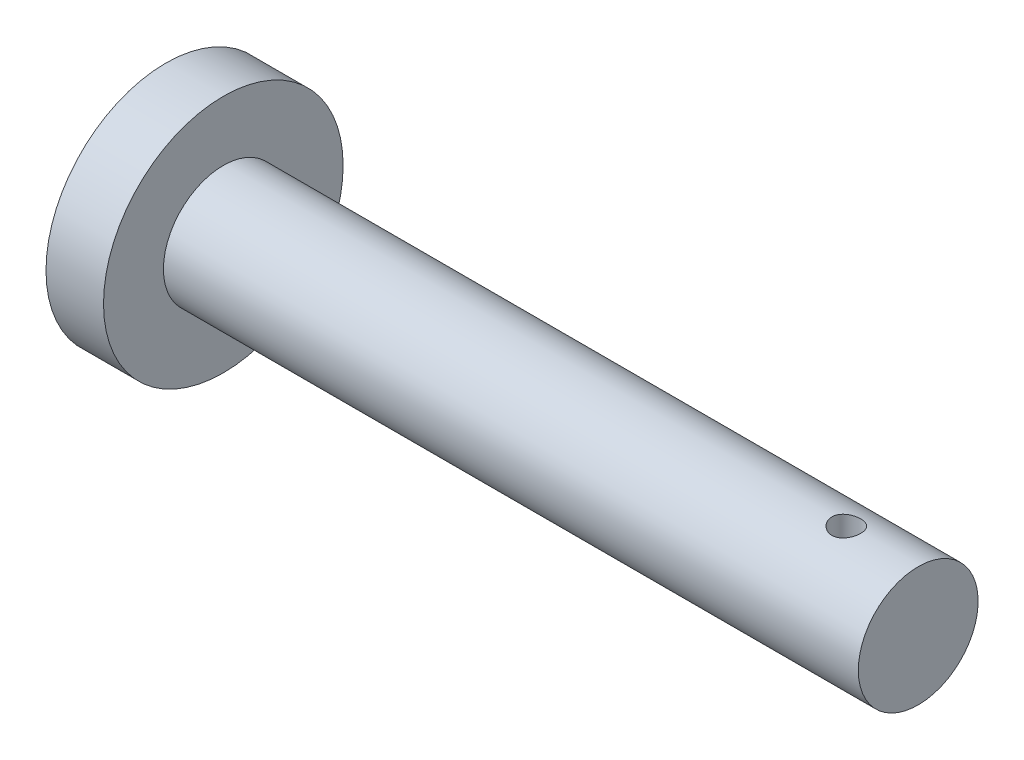
ISO-10303-21;
HEADER;
FILE_DESCRIPTION(('STEP AP214'),'2;1');
FILE_NAME('part.step','',(''),(''),'','','');
FILE_SCHEMA(('AUTOMOTIVE_DESIGN { 1 0 10303 214 1 1 1 1 }'));
ENDSEC;
DATA;
#1=APPLICATION_CONTEXT('core data for automotive mechanical design processes');
#2=APPLICATION_PROTOCOL_DEFINITION('international standard','automotive_design',2000,#1);
#3=PRODUCT_CONTEXT('',#1,'mechanical');
#4=PRODUCT('Part','Part','',(#3));
#5=PRODUCT_RELATED_PRODUCT_CATEGORY('part','',(#4));
#6=PRODUCT_DEFINITION_FORMATION('','',#4);
#7=PRODUCT_DEFINITION_CONTEXT('part definition',#1,'design');
#8=PRODUCT_DEFINITION('design','',#6,#7);
#9=PRODUCT_DEFINITION_SHAPE('','',#8);
#10=(LENGTH_UNIT() NAMED_UNIT(*) SI_UNIT(.MILLI.,.METRE.));
#11=(NAMED_UNIT(*) PLANE_ANGLE_UNIT() SI_UNIT($,.RADIAN.));
#12=(NAMED_UNIT(*) SI_UNIT($,.STERADIAN.) SOLID_ANGLE_UNIT());
#13=UNCERTAINTY_MEASURE_WITH_UNIT(LENGTH_MEASURE(1.E-05),#10,'distance_accuracy_value','');
#14=(GEOMETRIC_REPRESENTATION_CONTEXT(3) GLOBAL_UNCERTAINTY_ASSIGNED_CONTEXT((#13)) GLOBAL_UNIT_ASSIGNED_CONTEXT((#10,
#11,#12)) REPRESENTATION_CONTEXT('',''));
#15=CARTESIAN_POINT('',(0.,0.,0.));
#16=DIRECTION('',(0.,0.,1.));
#17=DIRECTION('',(1.,0.,0.));
#18=AXIS2_PLACEMENT_3D('',#15,#16,#17);
#19=CARTESIAN_POINT('',(0.,0.,0.));
#20=DIRECTION('',(-1.,0.,0.));
#21=DIRECTION('',(0.,0.,1.));
#22=AXIS2_PLACEMENT_3D('',#19,#20,#21);
#23=PLANE('',#22);
#24=CARTESIAN_POINT('',(0.,0.,0.));
#25=DIRECTION('',(-1.,0.,0.));
#26=DIRECTION('',(0.,0.,1.));
#27=AXIS2_PLACEMENT_3D('',#24,#25,#26);
#28=CIRCLE('',#27,12.5);
#29=CARTESIAN_POINT('',(0.,0.,12.5));
#30=VERTEX_POINT('',#29);
#31=EDGE_CURVE('E10',#30,#30,#28,.T.);
#32=ORIENTED_EDGE('',*,*,#31,.F.);
#33=EDGE_LOOP('',(#32));
#34=FACE_BOUND('',#33,.T.);
#35=ADVANCED_FACE('F30',(#34),#23,.F.);
#36=CARTESIAN_POINT('',(-157.,0.,0.));
#37=DIRECTION('',(-1.,0.,0.));
#38=DIRECTION('',(0.,0.,1.));
#39=AXIS2_PLACEMENT_3D('',#36,#37,#38);
#40=CYLINDRICAL_SURFACE('',#39,12.5);
#41=CARTESIAN_POINT('',(-15.,-12.1346610995116,3.));
#42=CARTESIAN_POINT('',(-14.8341136860563,-12.1346643709057,2.999994926396));
#43=CARTESIAN_POINT('',(-14.6681696981775,-12.1380998279897,2.9861940157555));
#44=CARTESIAN_POINT('',(-14.3410316472803,-12.1514386999622,2.93143372377318));
#45=CARTESIAN_POINT('',(-14.179840636512,-12.1613461803941,2.89045727127241));
#46=CARTESIAN_POINT('',(-13.866987704597,-12.1864438536979,2.78273587845348));
#47=CARTESIAN_POINT('',(-13.7153143658059,-12.2016275682829,2.71602252749926));
#48=CARTESIAN_POINT('',(-13.4253004563428,-12.2355589227548,2.55881551789466));
#49=CARTESIAN_POINT('',(-13.2869601763304,-12.2543066403104,2.46832134098417));
#50=CARTESIAN_POINT('',(-13.0247311850598,-12.2936793084446,2.26416092165145));
#51=CARTESIAN_POINT('',(-12.9011528440104,-12.3143323081787,2.15010136587796));
#52=CARTESIAN_POINT('',(-12.6746846055658,-12.3549444196641,1.90289576315871));
#53=CARTESIAN_POINT('',(-12.5717965288073,-12.3749034702238,1.76974803831651));
#54=CARTESIAN_POINT('',(-12.3883735672939,-12.4121875957975,1.48603435008245));
#55=CARTESIAN_POINT('',(-12.3081414764507,-12.429475709008,1.33526735140698));
#56=CARTESIAN_POINT('',(-12.1742734626821,-12.4591511096291,1.0219036434405));
#57=CARTESIAN_POINT('',(-12.1206339318546,-12.471539061815,0.859308542342426));
#58=CARTESIAN_POINT('',(-12.0424618456135,-12.4898200905274,0.530137152798911));
#59=CARTESIAN_POINT('',(-12.0174027857917,-12.4958305032045,0.363692527541));
#60=CARTESIAN_POINT('',(-11.9954524803083,-12.5010873481438,0.0288605739758598));
#61=CARTESIAN_POINT('',(-11.9985573840758,-12.5003347050497,-0.139526485618308));
#62=CARTESIAN_POINT('',(-12.0324637007849,-12.49223836428,-0.469819197188795));
#63=CARTESIAN_POINT('',(-12.0626970841685,-12.4850298487431,-0.631786969117104));
#64=CARTESIAN_POINT('',(-12.1490917379628,-12.4649879597451,-0.948279915829271));
#65=CARTESIAN_POINT('',(-12.2052543251028,-12.4521543006312,-1.10280471220598));
#66=CARTESIAN_POINT('',(-12.3423868327477,-12.4220937673228,-1.40154850796015));
#67=CARTESIAN_POINT('',(-12.4235632557684,-12.4048305309055,-1.54566890739797));
#68=CARTESIAN_POINT('',(-12.6082634336662,-12.3677903650575,-1.81844374815069));
#69=CARTESIAN_POINT('',(-12.7117908007732,-12.3480130295253,-1.94709568430373));
#70=CARTESIAN_POINT('',(-12.9413154010846,-12.307523454591,-2.18866676072893));
#71=CARTESIAN_POINT('',(-13.0678093661689,-12.2868002024655,-2.30111257110785));
#72=CARTESIAN_POINT('',(-13.3380756361584,-12.247210122564,-2.50329554889259));
#73=CARTESIAN_POINT('',(-13.4818486239031,-12.2283433682075,-2.59303181841776));
#74=CARTESIAN_POINT('',(-13.7834652562631,-12.1945661246798,-2.74751986313759));
#75=CARTESIAN_POINT('',(-13.9413650510763,-12.1796724534131,-2.81216594132899));
#76=CARTESIAN_POINT('',(-14.2662331234768,-12.155748323081,-2.91385324316721));
#77=CARTESIAN_POINT('',(-14.4331996246833,-12.1467167199581,-2.95089985341171));
#78=CARTESIAN_POINT('',(-14.7670933800678,-12.1357772660229,-2.99556850234642));
#79=CARTESIAN_POINT('',(-14.9339220725108,-12.1337008786288,-3.00388683328911));
#80=CARTESIAN_POINT('',(-15.2665831940748,-12.1364495609797,-2.99276203410493));
#81=CARTESIAN_POINT('',(-15.4324157058037,-12.1412740503119,-2.97332123871795));
#82=CARTESIAN_POINT('',(-15.7558459172609,-12.1571201522343,-2.90783852027801));
#83=CARTESIAN_POINT('',(-15.9135291759169,-12.1680489760353,-2.86219461484814));
#84=CARTESIAN_POINT('',(-16.219007820667,-12.1947857126681,-2.74603914988784));
#85=CARTESIAN_POINT('',(-16.3668021054363,-12.2105941678427,-2.67552482603031));
#86=CARTESIAN_POINT('',(-16.6512787522039,-12.2456689266468,-2.51014743676235));
#87=CARTESIAN_POINT('',(-16.787709374006,-12.2649930224287,-2.41486385815303));
#88=CARTESIAN_POINT('',(-17.0429007338939,-12.3047764880024,-2.20319051610381));
#89=CARTESIAN_POINT('',(-17.1616588009854,-12.3252360287629,-2.08679756812263));
#90=CARTESIAN_POINT('',(-17.3809150096092,-12.3655511140332,-1.83302860512641));
#91=CARTESIAN_POINT('',(-17.4809337559896,-12.3853821651221,-1.69523379949056));
#92=CARTESIAN_POINT('',(-17.656408463085,-12.4217193399951,-1.40439761806721));
#93=CARTESIAN_POINT('',(-17.7318656724446,-12.438225632785,-1.25135701785303));
#94=CARTESIAN_POINT('',(-17.855447477275,-12.4659520953338,-0.935406182533396));
#95=CARTESIAN_POINT('',(-17.9037623205216,-12.4772089625634,-0.772573732033524));
#96=CARTESIAN_POINT('',(-17.9722678203968,-12.4933282808784,-0.44079751662121));
#97=CARTESIAN_POINT('',(-17.9924634527554,-12.4981918632553,-0.271854838350957));
#98=CARTESIAN_POINT('',(-18.003895867787,-12.5009346170348,0.0628273325379078));
#99=CARTESIAN_POINT('',(-17.9958427559416,-12.4989850590467,0.22854154859205));
#100=CARTESIAN_POINT('',(-17.9526200369824,-12.4886960978661,0.556181588106272));
#101=CARTESIAN_POINT('',(-17.9174511235912,-12.4803568581455,0.718107508375785));
#102=CARTESIAN_POINT('',(-17.8213631748843,-12.4582475403262,1.03289533638029));
#103=CARTESIAN_POINT('',(-17.7605634305591,-12.4445026408745,1.18579554017999));
#104=CARTESIAN_POINT('',(-17.6150497558514,-12.4130357959962,1.47930912419136));
#105=CARTESIAN_POINT('',(-17.5303330262537,-12.3953133850962,1.61992106367531));
#106=CARTESIAN_POINT('',(-17.337174525723,-12.3573152907204,1.88826701153781));
#107=CARTESIAN_POINT('',(-17.2282449292564,-12.3369914041701,2.01564306622629));
#108=CARTESIAN_POINT('',(-16.9907123894102,-12.296311274744,2.25054951565269));
#109=CARTESIAN_POINT('',(-16.8621045592637,-12.2759550250775,2.35807496614236));
#110=CARTESIAN_POINT('',(-16.5862606058398,-12.2371275634283,2.5519948518568));
#111=CARTESIAN_POINT('',(-16.438747379493,-12.2186938455572,2.63800316633774));
#112=CARTESIAN_POINT('',(-16.1309381534944,-12.1862909651906,2.78387070894251));
#113=CARTESIAN_POINT('',(-15.9706520843289,-12.1723183758181,2.84375002144869));
#114=CARTESIAN_POINT('',(-15.6754071464859,-12.1527391085338,2.92614436386637));
#115=CARTESIAN_POINT('',(-15.5419291717888,-12.1460087939348,2.95378236710749));
#116=CARTESIAN_POINT('',(-15.2723136259292,-12.1369686046644,2.99071161192546));
#117=CARTESIAN_POINT('',(-15.1361762455769,-12.1346584140208,3.00000416492674));
#118=CARTESIAN_POINT('',(-15.,-12.1346610995116,3.));
#119=B_SPLINE_CURVE_WITH_KNOTS('',3,(#41,#42,#43,#44,#45,#46,#47,#48,#49,#50,#51,#52,#53,#54,
#55,#56,#57,#58,#59,#60,#61,#62,#63,#64,#65,#66,#67,#68,#69,#70,#71,#72,#73,#74,#75,#76,#77,#78,
#79,#80,#81,#82,#83,#84,#85,#86,#87,#88,#89,#90,#91,#92,#93,#94,#95,#96,#97,#98,#99,#100,#101,
#102,#103,#104,#105,#106,#107,#108,#109,#110,#111,#112,#113,#114,#115,#116,#117,#118),
.UNSPECIFIED.,.T.,.F.,(4,2,2,2,2,2,2,2,2,2,2,2,2,2,2,2,2,2,2,2,2,2,2,2,2,2,2,2,2,2,2,2,2,2,2,2,
2,2,4),(0.,0.497159212189435,0.9946310265389,1.49149417875254,1.98836816009861,2.49432418194045,
3.00032470584734,3.51279830766303,4.02520236141813,4.52800628486068,5.03074146609936,
5.52318961529222,6.01566277459448,6.51231571921414,7.00904899016388,7.51819168467208,
8.02735450631452,8.53863957226521,9.04982482437228,9.54852995993759,10.047193153326,
10.5384749824062,11.0298114342859,11.5301065260645,12.0304771548043,12.5422844123508,
13.0540656468818,13.5622134292334,14.0702712827588,14.5656502933719,15.0610166307768,
15.5541024543049,16.047246011943,16.5514085771014,17.0556965465884,17.56847227941,
18.0808531634825,18.4890008491296,18.8971193572843),.UNSPECIFIED.);
#120=CARTESIAN_POINT('',(-15.,-12.1346610995116,3.));
#121=VERTEX_POINT('',#120);
#122=EDGE_CURVE('E33',#121,#121,#119,.T.);
#123=ORIENTED_EDGE('',*,*,#122,.T.);
#124=EDGE_LOOP('',(#123));
#125=FACE_BOUND('',#124,.T.);
#126=CARTESIAN_POINT('',(-15.,12.1346610995116,3.));
#127=CARTESIAN_POINT('',(-15.1658863139436,12.1346643709057,2.999994926396));
#128=CARTESIAN_POINT('',(-15.3318303018224,12.1380998279897,2.9861940157555));
#129=CARTESIAN_POINT('',(-15.6589683527196,12.1514386999622,2.93143372377318));
#130=CARTESIAN_POINT('',(-15.8201593634879,12.1613461803941,2.89045727127241));
#131=CARTESIAN_POINT('',(-16.1330122954029,12.1864438536979,2.78273587845348));
#132=CARTESIAN_POINT('',(-16.284685634194,12.2016275682829,2.71602252749926));
#133=CARTESIAN_POINT('',(-16.5746995436572,12.2355589227548,2.55881551789466));
#134=CARTESIAN_POINT('',(-16.7130398236695,12.2543066403104,2.46832134098417));
#135=CARTESIAN_POINT('',(-16.9752688149401,12.2936793084446,2.26416092165145));
#136=CARTESIAN_POINT('',(-17.0988471559895,12.3143323081787,2.15010136587795));
#137=CARTESIAN_POINT('',(-17.3253153944341,12.3549444196641,1.90289576315871));
#138=CARTESIAN_POINT('',(-17.4282034711926,12.3749034702238,1.7697480383165));
#139=CARTESIAN_POINT('',(-17.611626432706,12.4121875957975,1.48603435008244));
#140=CARTESIAN_POINT('',(-17.6918585235492,12.429475709008,1.33526735140698));
#141=CARTESIAN_POINT('',(-17.8257265373178,12.4591511096291,1.0219036434405));
#142=CARTESIAN_POINT('',(-17.8793660681453,12.471539061815,0.859308542342424));
#143=CARTESIAN_POINT('',(-17.9575381543864,12.4898200905274,0.530137152798909));
#144=CARTESIAN_POINT('',(-17.9825972142082,12.4958305032045,0.363692527540998));
#145=CARTESIAN_POINT('',(-18.0045475196916,12.5010873481438,0.0288605739758569));
#146=CARTESIAN_POINT('',(-18.0014426159241,12.5003347050497,-0.139526485618311));
#147=CARTESIAN_POINT('',(-17.967536299215,12.49223836428,-0.469819197188798));
#148=CARTESIAN_POINT('',(-17.9373029158314,12.4850298487431,-0.631786969117107));
#149=CARTESIAN_POINT('',(-17.8509082620371,12.4649879597451,-0.948279915829274));
#150=CARTESIAN_POINT('',(-17.7947456748971,12.4521543006312,-1.10280471220598));
#151=CARTESIAN_POINT('',(-17.6576131672522,12.4220937673228,-1.40154850796015));
#152=CARTESIAN_POINT('',(-17.5764367442315,12.4048305309055,-1.54566890739798));
#153=CARTESIAN_POINT('',(-17.3917365663337,12.3677903650575,-1.8184437481507));
#154=CARTESIAN_POINT('',(-17.2882091992267,12.3480130295253,-1.94709568430374));
#155=CARTESIAN_POINT('',(-17.0586845989154,12.307523454591,-2.18866676072893));
#156=CARTESIAN_POINT('',(-16.932190633831,12.2868002024655,-2.30111257110785));
#157=CARTESIAN_POINT('',(-16.6619243638415,12.247210122564,-2.50329554889259));
#158=CARTESIAN_POINT('',(-16.5181513760968,12.2283433682075,-2.59303181841777));
#159=CARTESIAN_POINT('',(-16.2165347437368,12.1945661246798,-2.74751986313759));
#160=CARTESIAN_POINT('',(-16.0586349489236,12.1796724534131,-2.81216594132899));
#161=CARTESIAN_POINT('',(-15.7337668765231,12.155748323081,-2.91385324316721));
#162=CARTESIAN_POINT('',(-15.5668003753166,12.1467167199581,-2.95089985341171));
#163=CARTESIAN_POINT('',(-15.2329066199321,12.1357772660229,-2.99556850234642));
#164=CARTESIAN_POINT('',(-15.0660779274891,12.1337008786288,-3.00388683328911));
#165=CARTESIAN_POINT('',(-14.7334168059252,12.1364495609797,-2.99276203410493));
#166=CARTESIAN_POINT('',(-14.5675842941962,12.1412740503119,-2.97332123871795));
#167=CARTESIAN_POINT('',(-14.244154082739,12.1571201522343,-2.90783852027801));
#168=CARTESIAN_POINT('',(-14.086470824083,12.1680489760353,-2.86219461484814));
#169=CARTESIAN_POINT('',(-13.7809921793329,12.1947857126681,-2.74603914988784));
#170=CARTESIAN_POINT('',(-13.6331978945637,12.2105941678427,-2.6755248260303));
#171=CARTESIAN_POINT('',(-13.348721247796,12.2456689266468,-2.51014743676235));
#172=CARTESIAN_POINT('',(-13.2122906259939,12.2649930224287,-2.41486385815303));
#173=CARTESIAN_POINT('',(-12.957099266106,12.3047764880024,-2.2031905161038));
#174=CARTESIAN_POINT('',(-12.8383411990145,12.3252360287629,-2.08679756812263));
#175=CARTESIAN_POINT('',(-12.6190849903907,12.3655511140332,-1.8330286051264));
#176=CARTESIAN_POINT('',(-12.5190662440103,12.3853821651221,-1.69523379949055));
#177=CARTESIAN_POINT('',(-12.3435915369149,12.4217193399951,-1.4043976180672));
#178=CARTESIAN_POINT('',(-12.2681343275553,12.438225632785,-1.25135701785302));
#179=CARTESIAN_POINT('',(-12.1445525227249,12.4659520953338,-0.935406182533391));
#180=CARTESIAN_POINT('',(-12.0962376794783,12.4772089625634,-0.772573732033519));
#181=CARTESIAN_POINT('',(-12.0277321796031,12.4933282808784,-0.440797516621206));
#182=CARTESIAN_POINT('',(-12.0075365472445,12.4981918632553,-0.271854838350953));
#183=CARTESIAN_POINT('',(-11.9961041322129,12.5009346170348,0.0628273325379106));
#184=CARTESIAN_POINT('',(-12.0041572440584,12.4989850590467,0.228541548592053));
#185=CARTESIAN_POINT('',(-12.0473799630175,12.4886960978661,0.556181588106275));
#186=CARTESIAN_POINT('',(-12.0825488764087,12.4803568581455,0.718107508375788));
#187=CARTESIAN_POINT('',(-12.1786368251157,12.4582475403261,1.03289533638029));
#188=CARTESIAN_POINT('',(-12.2394365694408,12.4445026408745,1.18579554017999));
#189=CARTESIAN_POINT('',(-12.3849502441486,12.4130357959962,1.47930912419136));
#190=CARTESIAN_POINT('',(-12.4696669737462,12.3953133850962,1.61992106367531));
#191=CARTESIAN_POINT('',(-12.6628254742769,12.3573152907204,1.88826701153781));
#192=CARTESIAN_POINT('',(-12.7717550707435,12.3369914041701,2.01564306622629));
#193=CARTESIAN_POINT('',(-13.0092876105897,12.296311274744,2.25054951565269));
#194=CARTESIAN_POINT('',(-13.1378954407363,12.2759550250775,2.35807496614237));
#195=CARTESIAN_POINT('',(-13.4137393941601,12.2371275634283,2.5519948518568));
#196=CARTESIAN_POINT('',(-13.561252620507,12.2186938455572,2.63800316633774));
#197=CARTESIAN_POINT('',(-13.8690618465055,12.1862909651906,2.78387070894252));
#198=CARTESIAN_POINT('',(-14.029347915671,12.1723183758181,2.84375002144869));
#199=CARTESIAN_POINT('',(-14.324592853514,12.1527391085338,2.92614436386637));
#200=CARTESIAN_POINT('',(-14.4580708282112,12.1460087939348,2.95378236710749));
#201=CARTESIAN_POINT('',(-14.7276863740708,12.1369686046644,2.99071161192546));
#202=CARTESIAN_POINT('',(-14.863823754423,12.1346584140208,3.00000416492674));
#203=CARTESIAN_POINT('',(-15.,12.1346610995116,3.));
#204=B_SPLINE_CURVE_WITH_KNOTS('',3,(#126,#127,#128,#129,#130,#131,#132,#133,#134,#135,#136,
#137,#138,#139,#140,#141,#142,#143,#144,#145,#146,#147,#148,#149,#150,#151,#152,#153,#154,#155,
#156,#157,#158,#159,#160,#161,#162,#163,#164,#165,#166,#167,#168,#169,#170,#171,#172,#173,#174,
#175,#176,#177,#178,#179,#180,#181,#182,#183,#184,#185,#186,#187,#188,#189,#190,#191,#192,#193,
#194,#195,#196,#197,#198,#199,#200,#201,#202,#203),.UNSPECIFIED.,.T.,.F.,(4,2,2,2,2,2,2,2,2,2,2,
2,2,2,2,2,2,2,2,2,2,2,2,2,2,2,2,2,2,2,2,2,2,2,2,2,2,2,4),(0.,0.497159212189435,
0.994631026538901,1.49149417875254,1.98836816009861,2.49432418194046,3.00032470584734,
3.51279830766303,4.02520236141814,4.52800628486068,5.03074146609936,5.52318961529223,
6.01566277459448,6.51231571921414,7.00904899016388,7.51819168467209,8.02735450631452,
8.5386395722652,9.04982482437228,9.54852995993759,10.047193153326,10.5384749824062,
11.0298114342859,11.5301065260645,12.0304771548043,12.5422844123508,13.0540656468818,
13.5622134292334,14.0702712827588,14.5656502933719,15.0610166307768,15.5541024543049,
16.047246011943,16.5514085771014,17.0556965465884,17.56847227941,18.0808531634825,
18.4890008491296,18.8971193572843),.UNSPECIFIED.);
#205=CARTESIAN_POINT('',(-15.,12.1346610995116,3.));
#206=VERTEX_POINT('',#205);
#207=EDGE_CURVE('E49',#206,#206,#204,.T.);
#208=ORIENTED_EDGE('',*,*,#207,.T.);
#209=EDGE_LOOP('',(#208));
#210=FACE_BOUND('',#209,.T.);
#211=CARTESIAN_POINT('',(-145.,0.,0.));
#212=DIRECTION('',(-1.,0.,0.));
#213=DIRECTION('',(0.,0.,1.));
#214=AXIS2_PLACEMENT_3D('',#211,#212,#213);
#215=CIRCLE('',#214,12.5);
#216=CARTESIAN_POINT('',(-145.,0.,12.5));
#217=VERTEX_POINT('',#216);
#218=EDGE_CURVE('E41',#217,#217,#215,.T.);
#219=ORIENTED_EDGE('',*,*,#218,.F.);
#220=EDGE_LOOP('',(#219));
#221=FACE_BOUND('',#220,.T.);
#222=ORIENTED_EDGE('',*,*,#31,.T.);
#223=EDGE_LOOP('',(#222));
#224=FACE_BOUND('',#223,.T.);
#225=ADVANCED_FACE('F54',(#125,#210,#221,#224),#40,.T.);
#226=CARTESIAN_POINT('',(-145.,12.5,0.));
#227=DIRECTION('',(-1.,0.,0.));
#228=DIRECTION('',(0.,0.,1.));
#229=AXIS2_PLACEMENT_3D('',#226,#227,#228);
#230=PLANE('',#229);
#231=CARTESIAN_POINT('',(-145.,0.,0.));
#232=DIRECTION('',(-1.,0.,0.));
#233=DIRECTION('',(0.,0.,1.));
#234=AXIS2_PLACEMENT_3D('',#231,#232,#233);
#235=CIRCLE('',#234,25.);
#236=CARTESIAN_POINT('',(-145.,0.,25.));
#237=VERTEX_POINT('',#236);
#238=EDGE_CURVE('E46',#237,#237,#235,.T.);
#239=ORIENTED_EDGE('',*,*,#238,.F.);
#240=EDGE_LOOP('',(#239));
#241=FACE_BOUND('',#240,.T.);
#242=ORIENTED_EDGE('',*,*,#218,.T.);
#243=EDGE_LOOP('',(#242));
#244=FACE_BOUND('',#243,.T.);
#245=ADVANCED_FACE('F69',(#241,#244),#230,.F.);
#246=CARTESIAN_POINT('',(-157.,0.,0.));
#247=DIRECTION('',(-1.,0.,0.));
#248=DIRECTION('',(0.,0.,1.));
#249=AXIS2_PLACEMENT_3D('',#246,#247,#248);
#250=CYLINDRICAL_SURFACE('',#249,25.);
#251=CARTESIAN_POINT('',(-157.,0.,0.));
#252=DIRECTION('',(-1.,0.,0.));
#253=DIRECTION('',(0.,0.,1.));
#254=AXIS2_PLACEMENT_3D('',#251,#252,#253);
#255=CIRCLE('',#254,25.);
#256=CARTESIAN_POINT('',(-157.,0.,25.));
#257=VERTEX_POINT('',#256);
#258=EDGE_CURVE('E119',#257,#257,#255,.T.);
#259=ORIENTED_EDGE('',*,*,#258,.F.);
#260=EDGE_LOOP('',(#259));
#261=FACE_BOUND('',#260,.T.);
#262=ORIENTED_EDGE('',*,*,#238,.T.);
#263=EDGE_LOOP('',(#262));
#264=FACE_BOUND('',#263,.T.);
#265=ADVANCED_FACE('F66',(#261,#264),#250,.T.);
#266=CARTESIAN_POINT('',(-157.,25.,0.));
#267=DIRECTION('',(1.,0.,0.));
#268=DIRECTION('',(0.,0.,-1.));
#269=AXIS2_PLACEMENT_3D('',#266,#267,#268);
#270=PLANE('',#269);
#271=ORIENTED_EDGE('',*,*,#258,.T.);
#272=EDGE_LOOP('',(#271));
#273=FACE_BOUND('',#272,.T.);
#274=ADVANCED_FACE('F61',(#273),#270,.F.);
#275=CARTESIAN_POINT('',(-15.,-25.,0.));
#276=DIRECTION('',(0.,1.,0.));
#277=DIRECTION('',(0.,0.,1.));
#278=AXIS2_PLACEMENT_3D('',#275,#276,#277);
#279=CYLINDRICAL_SURFACE('',#278,3.);
#280=ORIENTED_EDGE('',*,*,#207,.F.);
#281=EDGE_LOOP('',(#280));
#282=FACE_BOUND('',#281,.T.);
#283=ORIENTED_EDGE('',*,*,#122,.F.);
#284=EDGE_LOOP('',(#283));
#285=FACE_BOUND('',#284,.T.);
#286=ADVANCED_FACE('F57',(#282,#285),#279,.F.);
#287=CLOSED_SHELL('',(#35,#225,#245,#265,#274,#286));
#288=MANIFOLD_SOLID_BREP('B2',#287);
#289=ADVANCED_BREP_SHAPE_REPRESENTATION('',(#18,#288),#14);
#290=SHAPE_DEFINITION_REPRESENTATION(#9,#289);
ENDSEC;
END-ISO-10303-21;
